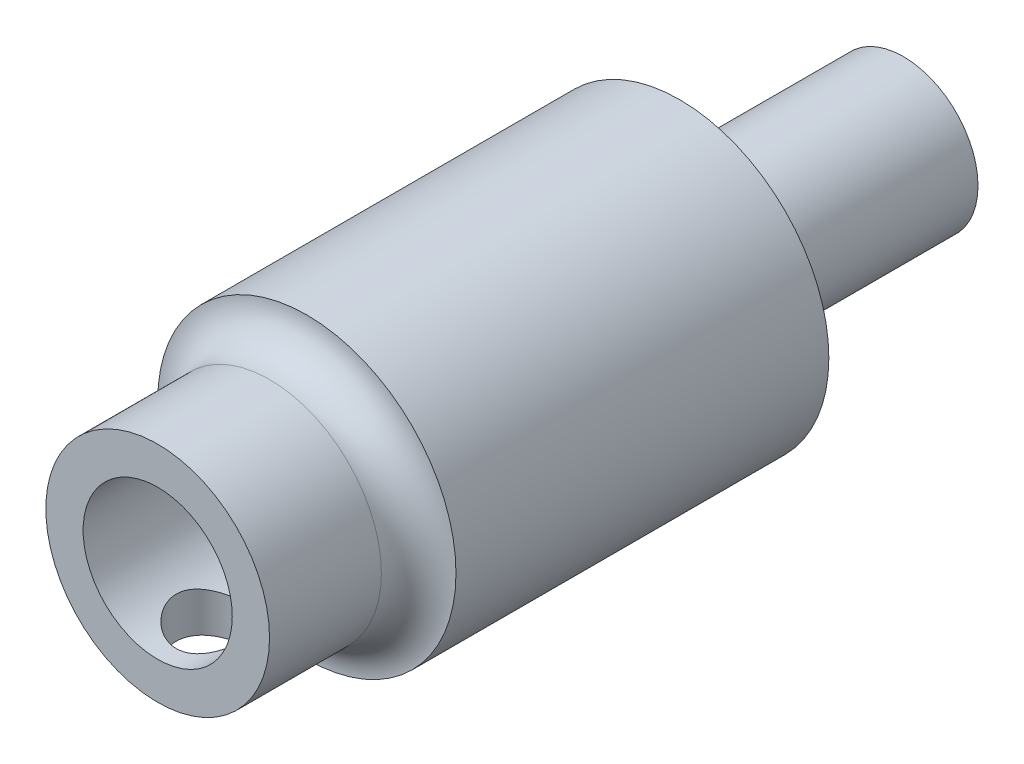
ISO-10303-21;
HEADER;
FILE_DESCRIPTION(('STEP AP214'),'2;1');
FILE_NAME('part.step','',(''),(''),'','','');
FILE_SCHEMA(('AUTOMOTIVE_DESIGN { 1 0 10303 214 1 1 1 1 }'));
ENDSEC;
DATA;
#1=APPLICATION_CONTEXT('core data for automotive mechanical design processes');
#2=APPLICATION_PROTOCOL_DEFINITION('international standard','automotive_design',2000,#1);
#3=PRODUCT_CONTEXT('',#1,'mechanical');
#4=PRODUCT('Part','Part','',(#3));
#5=PRODUCT_RELATED_PRODUCT_CATEGORY('part','',(#4));
#6=PRODUCT_DEFINITION_FORMATION('','',#4);
#7=PRODUCT_DEFINITION_CONTEXT('part definition',#1,'design');
#8=PRODUCT_DEFINITION('design','',#6,#7);
#9=PRODUCT_DEFINITION_SHAPE('','',#8);
#10=(LENGTH_UNIT() NAMED_UNIT(*) SI_UNIT(.MILLI.,.METRE.));
#11=(NAMED_UNIT(*) PLANE_ANGLE_UNIT() SI_UNIT($,.RADIAN.));
#12=(NAMED_UNIT(*) SI_UNIT($,.STERADIAN.) SOLID_ANGLE_UNIT());
#13=UNCERTAINTY_MEASURE_WITH_UNIT(LENGTH_MEASURE(1.E-05),#10,'distance_accuracy_value','');
#14=(GEOMETRIC_REPRESENTATION_CONTEXT(3) GLOBAL_UNCERTAINTY_ASSIGNED_CONTEXT((#13)) GLOBAL_UNIT_ASSIGNED_CONTEXT((#10,
#11,#12)) REPRESENTATION_CONTEXT('',''));
#15=CARTESIAN_POINT('',(0.,0.,0.));
#16=DIRECTION('',(0.,0.,1.));
#17=DIRECTION('',(1.,0.,0.));
#18=AXIS2_PLACEMENT_3D('',#15,#16,#17);
#19=CARTESIAN_POINT('',(0.,0.,5.5));
#20=DIRECTION('',(0.,0.,1.));
#21=DIRECTION('',(1.,0.,0.));
#22=AXIS2_PLACEMENT_3D('',#19,#20,#21);
#23=TOROIDAL_SURFACE('',#22,2.,0.5);
#24=CARTESIAN_POINT('',(0.,0.,5.));
#25=DIRECTION('',(0.,0.,1.));
#26=DIRECTION('',(1.,0.,0.));
#27=AXIS2_PLACEMENT_3D('',#24,#25,#26);
#28=CIRCLE('',#27,2.);
#29=CARTESIAN_POINT('',(2.,0.,5.));
#30=VERTEX_POINT('',#29);
#31=EDGE_CURVE('E103',#30,#30,#28,.T.);
#32=ORIENTED_EDGE('',*,*,#31,.T.);
#33=EDGE_LOOP('',(#32));
#34=FACE_BOUND('',#33,.T.);
#35=CARTESIAN_POINT('',(0.,0.,5.5));
#36=DIRECTION('',(0.,0.,1.));
#37=DIRECTION('',(1.,0.,0.));
#38=AXIS2_PLACEMENT_3D('',#35,#36,#37);
#39=CIRCLE('',#38,1.5);
#40=CARTESIAN_POINT('',(1.5,0.,5.5));
#41=VERTEX_POINT('',#40);
#42=EDGE_CURVE('E65',#41,#41,#39,.T.);
#43=ORIENTED_EDGE('',*,*,#42,.F.);
#44=EDGE_LOOP('',(#43));
#45=FACE_BOUND('',#44,.T.);
#46=ADVANCED_FACE('F41',(#34,#45),#23,.F.);
#47=CARTESIAN_POINT('',(0.,0.,-0.5));
#48=DIRECTION('',(0.,0.,1.));
#49=DIRECTION('',(1.,0.,0.));
#50=AXIS2_PLACEMENT_3D('',#47,#48,#49);
#51=TOROIDAL_SURFACE('',#50,1.5,0.5);
#52=CARTESIAN_POINT('',(0.,0.,0.));
#53=DIRECTION('',(0.,0.,1.));
#54=DIRECTION('',(1.,0.,0.));
#55=AXIS2_PLACEMENT_3D('',#52,#53,#54);
#56=CIRCLE('',#55,1.5);
#57=CARTESIAN_POINT('',(1.5,0.,0.));
#58=VERTEX_POINT('',#57);
#59=EDGE_CURVE('E114',#58,#58,#56,.T.);
#60=ORIENTED_EDGE('',*,*,#59,.F.);
#61=EDGE_LOOP('',(#60));
#62=FACE_BOUND('',#61,.T.);
#63=CARTESIAN_POINT('',(0.,0.,-0.5));
#64=DIRECTION('',(0.,0.,1.));
#65=DIRECTION('',(1.,0.,0.));
#66=AXIS2_PLACEMENT_3D('',#63,#64,#65);
#67=CIRCLE('',#66,1.);
#68=CARTESIAN_POINT('',(1.,0.,-0.5));
#69=VERTEX_POINT('',#68);
#70=EDGE_CURVE('E118',#69,#69,#67,.F.);
#71=ORIENTED_EDGE('',*,*,#70,.F.);
#72=EDGE_LOOP('',(#71));
#73=FACE_BOUND('',#72,.T.);
#74=ADVANCED_FACE('F130',(#62,#73),#51,.F.);
#75=CARTESIAN_POINT('',(0.,0.,5.));
#76=DIRECTION('',(0.,0.,-1.));
#77=DIRECTION('',(-1.,0.,0.));
#78=AXIS2_PLACEMENT_3D('',#75,#76,#77);
#79=CYLINDRICAL_SURFACE('',#78,2.);
#80=ORIENTED_EDGE('',*,*,#31,.F.);
#81=EDGE_LOOP('',(#80));
#82=FACE_BOUND('',#81,.T.);
#83=CARTESIAN_POINT('',(0.,0.,0.));
#84=DIRECTION('',(0.,0.,1.));
#85=DIRECTION('',(1.,0.,0.));
#86=AXIS2_PLACEMENT_3D('',#83,#84,#85);
#87=CIRCLE('',#86,2.);
#88=CARTESIAN_POINT('',(2.,0.,0.));
#89=VERTEX_POINT('',#88);
#90=EDGE_CURVE('E102',#89,#89,#87,.T.);
#91=ORIENTED_EDGE('',*,*,#90,.T.);
#92=EDGE_LOOP('',(#91));
#93=FACE_BOUND('',#92,.T.);
#94=ADVANCED_FACE('F135',(#82,#93),#79,.T.);
#95=CARTESIAN_POINT('',(0.,0.,0.));
#96=DIRECTION('',(0.,0.,1.));
#97=DIRECTION('',(1.,0.,0.));
#98=AXIS2_PLACEMENT_3D('',#95,#96,#97);
#99=PLANE('',#98);
#100=ORIENTED_EDGE('',*,*,#59,.T.);
#101=EDGE_LOOP('',(#100));
#102=FACE_BOUND('',#101,.T.);
#103=ORIENTED_EDGE('',*,*,#90,.F.);
#104=EDGE_LOOP('',(#103));
#105=FACE_BOUND('',#104,.T.);
#106=ADVANCED_FACE('F141',(#102,#105),#99,.F.);
#107=CARTESIAN_POINT('',(0.,0.,7.));
#108=DIRECTION('',(0.,0.,1.));
#109=DIRECTION('',(1.,0.,0.));
#110=AXIS2_PLACEMENT_3D('',#107,#108,#109);
#111=PLANE('',#110);
#112=CARTESIAN_POINT('',(0.,0.,7.));
#113=DIRECTION('',(0.,0.,1.));
#114=DIRECTION('',(1.,0.,0.));
#115=AXIS2_PLACEMENT_3D('',#112,#113,#114);
#116=CIRCLE('',#115,1.5);
#117=CARTESIAN_POINT('',(1.5,0.,7.));
#118=VERTEX_POINT('',#117);
#119=EDGE_CURVE('E98',#118,#118,#116,.T.);
#120=ORIENTED_EDGE('',*,*,#119,.T.);
#121=EDGE_LOOP('',(#120));
#122=FACE_BOUND('',#121,.T.);
#123=CARTESIAN_POINT('',(0.,0.,7.));
#124=DIRECTION('',(0.,0.,1.));
#125=DIRECTION('',(1.,0.,0.));
#126=AXIS2_PLACEMENT_3D('',#123,#124,#125);
#127=CIRCLE('',#126,1.);
#128=CARTESIAN_POINT('',(1.,0.,7.));
#129=VERTEX_POINT('',#128);
#130=EDGE_CURVE('E94',#129,#129,#127,.T.);
#131=ORIENTED_EDGE('',*,*,#130,.F.);
#132=EDGE_LOOP('',(#131));
#133=FACE_BOUND('',#132,.T.);
#134=ADVANCED_FACE('F146',(#122,#133),#111,.T.);
#135=CARTESIAN_POINT('',(0.,0.,7.));
#136=DIRECTION('',(0.,0.,-1.));
#137=DIRECTION('',(-1.,0.,0.));
#138=AXIS2_PLACEMENT_3D('',#135,#136,#137);
#139=CYLINDRICAL_SURFACE('',#138,1.5);
#140=CARTESIAN_POINT('',(0.,-1.5,6.75));
#141=CARTESIAN_POINT('',(0.0272816814433612,-1.50000007650472,6.75000012686582));
#142=CARTESIAN_POINT('',(0.0545625972692746,-1.49924884753774,6.74775986693639));
#143=CARTESIAN_POINT('',(0.108320880436486,-1.49632605101639,6.73888544559139));
#144=CARTESIAN_POINT('',(0.134798164059408,-1.49415433601069,6.73225082802554));
#145=CARTESIAN_POINT('',(0.186166394750888,-1.48862653953228,6.71484037830797));
#146=CARTESIAN_POINT('',(0.211059912943018,-1.48527243865453,6.70407146877035));
#147=CARTESIAN_POINT('',(0.25868746840266,-1.47772222858644,6.67872941358084));
#148=CARTESIAN_POINT('',(0.281421078479346,-1.47352595333789,6.66415551749874));
#149=CARTESIAN_POINT('',(0.324870837511139,-1.46457047221606,6.63108709757058));
#150=CARTESIAN_POINT('',(0.345501850149179,-1.45979778232283,6.61248438286959));
#151=CARTESIAN_POINT('',(0.383416346351017,-1.45030157391171,6.57211642264688));
#152=CARTESIAN_POINT('',(0.400699092744639,-1.44557806643817,6.55035048253637));
#153=CARTESIAN_POINT('',(0.431912471114024,-1.43656666240137,6.50350744240113));
#154=CARTESIAN_POINT('',(0.445732429110873,-1.43229519643517,6.47835313013151));
#155=CARTESIAN_POINT('',(0.468909436938503,-1.42487652703629,6.42591195277315));
#156=CARTESIAN_POINT('',(0.478267848692048,-1.4217289805919,6.3986257414277));
#157=CARTESIAN_POINT('',(0.491936730754162,-1.41705651655216,6.34366338924975));
#158=CARTESIAN_POINT('',(0.496406724138346,-1.41548047960085,6.31603139573733));
#159=CARTESIAN_POINT('',(0.500670561669923,-1.41397828389571,6.2603681229003));
#160=CARTESIAN_POINT('',(0.500465850802425,-1.41405161531,6.23233696963626));
#161=CARTESIAN_POINT('',(0.495509951851011,-1.41579507485375,6.17803168477975));
#162=CARTESIAN_POINT('',(0.49096695658331,-1.41739207928749,6.15173579854096));
#163=CARTESIAN_POINT('',(0.477803081424895,-1.42188328867294,6.10030329019611));
#164=CARTESIAN_POINT('',(0.469181713295985,-1.42477764893409,6.07516680728234));
#165=CARTESIAN_POINT('',(0.447969529030053,-1.43158955564248,6.02629362520439));
#166=CARTESIAN_POINT('',(0.435317024353617,-1.43552282896189,6.00258598726527));
#167=CARTESIAN_POINT('',(0.406444553151583,-1.44396279288233,5.9575645458601));
#168=CARTESIAN_POINT('',(0.390223556182006,-1.44846964895333,5.9362514365333));
#169=CARTESIAN_POINT('',(0.353674666341114,-1.45783664583764,5.89545420091962));
#170=CARTESIAN_POINT('',(0.333176575038154,-1.46270294677393,5.87612365274547));
#171=CARTESIAN_POINT('',(0.289169784985032,-1.47203469193547,5.8411343666683));
#172=CARTESIAN_POINT('',(0.265660797830407,-1.47650009769041,5.82547598091775));
#173=CARTESIAN_POINT('',(0.215973806523133,-1.48458553968889,5.79815184988247));
#174=CARTESIAN_POINT('',(0.189771638208167,-1.48819675004018,5.78652725432964));
#175=CARTESIAN_POINT('',(0.135634541682253,-1.49410283572219,5.76789841302215));
#176=CARTESIAN_POINT('',(0.107700219077476,-1.4963981682744,5.76089256228828));
#177=CARTESIAN_POINT('',(0.0521919147646512,-1.4993381353572,5.75197216698882));
#178=CARTESIAN_POINT('',(0.024654799932422,-1.50005000916865,5.74985009541363));
#179=CARTESIAN_POINT('',(-0.0303875349801189,-1.49994451347413,5.75016633679923));
#180=CARTESIAN_POINT('',(-0.0578927596598242,-1.49912740209676,5.75260387998993));
#181=CARTESIAN_POINT('',(-0.11125993315213,-1.49610012358557,5.76180595386798));
#182=CARTESIAN_POINT('',(-0.137146403417429,-1.49393099355614,5.76844310302476));
#183=CARTESIAN_POINT('',(-0.187427979289781,-1.48845923415017,5.78569672223335));
#184=CARTESIAN_POINT('',(-0.21182289425428,-1.48515646023271,5.79631369973384));
#185=CARTESIAN_POINT('',(-0.259144148196661,-1.47764465643714,5.82153521592045));
#186=CARTESIAN_POINT('',(-0.282014979608665,-1.47341407378153,5.8362372966418));
#187=CARTESIAN_POINT('',(-0.325032415067702,-1.46452626957872,5.86909707500653));
#188=CARTESIAN_POINT('',(-0.345178183897447,-1.45986891795944,5.88725582801508));
#189=CARTESIAN_POINT('',(-0.383126253903507,-1.45038423991236,5.92748937550413));
#190=CARTESIAN_POINT('',(-0.400780484624246,-1.44555880547578,5.94970461346662));
#191=CARTESIAN_POINT('',(-0.432128761160427,-1.43649986643491,5.99688578390225));
#192=CARTESIAN_POINT('',(-0.445822773960422,-1.4322663667656,6.0218517393051));
#193=CARTESIAN_POINT('',(-0.468798465211681,-1.42491195910154,6.0738365076533));
#194=CARTESIAN_POINT('',(-0.478089066098884,-1.42178880450316,6.10085103962139));
#195=CARTESIAN_POINT('',(-0.491947333396082,-1.41705416199567,6.15618932506208));
#196=CARTESIAN_POINT('',(-0.496517127480622,-1.41544199311349,6.18451248271653));
#197=CARTESIAN_POINT('',(-0.50063814123519,-1.41398929437536,6.24009854800661));
#198=CARTESIAN_POINT('',(-0.500435128655464,-1.4140620017215,6.26734117012587));
#199=CARTESIAN_POINT('',(-0.495621146727439,-1.4157563496178,6.32138253744987));
#200=CARTESIAN_POINT('',(-0.491010439729444,-1.41737789797942,6.34818130897646));
#201=CARTESIAN_POINT('',(-0.477685906563491,-1.42192262139472,6.40006783150633));
#202=CARTESIAN_POINT('',(-0.46905167300744,-1.42482049007757,6.42517841250362));
#203=CARTESIAN_POINT('',(-0.447989682880191,-1.43158199412717,6.47361370346777));
#204=CARTESIAN_POINT('',(-0.43556108427699,-1.43544584382648,6.49693801559363));
#205=CARTESIAN_POINT('',(-0.406630346291625,-1.4439141461203,6.54224183496185));
#206=CARTESIAN_POINT('',(-0.389974121382267,-1.44854355820802,6.5641182509493));
#207=CARTESIAN_POINT('',(-0.353321441567849,-1.45791678141893,6.604844906692));
#208=CARTESIAN_POINT('',(-0.333324042225748,-1.46266062456259,6.62369428784401));
#209=CARTESIAN_POINT('',(-0.289620778460337,-1.47195015262697,6.65857220614462));
#210=CARTESIAN_POINT('',(-0.265800756749863,-1.47648090900608,6.67446217387551));
#211=CARTESIAN_POINT('',(-0.215678678703314,-1.48462995586326,6.70199521442532));
#212=CARTESIAN_POINT('',(-0.189377259066175,-1.4882484795397,6.71363937296102));
#213=CARTESIAN_POINT('',(-0.136246823600488,-1.49402757534266,6.73186081624434));
#214=CARTESIAN_POINT('',(-0.109493878838205,-1.4962460621126,6.73864123313169));
#215=CARTESIAN_POINT('',(-0.055160208005124,-1.49923203532112,6.74771014033856));
#216=CARTESIAN_POINT('',(-0.0275797127843737,-1.49999992265952,6.74999987174827));
#217=CARTESIAN_POINT('',(0.,-1.5,6.75));
#218=B_SPLINE_CURVE_WITH_KNOTS('',3,(#140,#141,#142,#143,#144,#145,#146,#147,#148,#149,#150,
#151,#152,#153,#154,#155,#156,#157,#158,#159,#160,#161,#162,#163,#164,#165,#166,#167,#168,#169,
#170,#171,#172,#173,#174,#175,#176,#177,#178,#179,#180,#181,#182,#183,#184,#185,#186,#187,#188,
#189,#190,#191,#192,#193,#194,#195,#196,#197,#198,#199,#200,#201,#202,#203,#204,#205,#206,#207,
#208,#209,#210,#211,#212,#213,#214,#215,#216,#217),.UNSPECIFIED.,.T.,.F.,(4,2,2,2,2,2,2,2,2,2,2,
2,2,2,2,2,2,2,2,2,2,2,2,2,2,2,2,2,2,2,2,2,2,2,2,2,2,2,4),(0.,0.0817435530130054,
0.163495592633761,0.245111336435137,0.32674318889955,0.41092342141378,0.495122166437651,
0.581741924117353,0.668335223464167,0.75200962868792,0.835658169894179,0.915484132713153,
0.995319654234163,1.07644085573241,1.15758551274779,1.24296652901359,1.32835572978984,
1.41459202820854,1.50079834434279,1.5832679158326,1.66572356577764,1.74579078984782,
1.82586822637727,1.90805199917543,1.99026090406621,2.07620511436051,2.16215004113173,
2.24792006907884,2.33365142346098,2.41497833023985,2.49630039666268,2.57607793530789,
2.65587319078569,2.73915033336482,2.8224510555247,2.9089983040813,2.99552340566808,
3.07818279177487,3.1608193300965),.UNSPECIFIED.);
#219=CARTESIAN_POINT('',(0.,-1.5,6.75));
#220=VERTEX_POINT('',#219);
#221=EDGE_CURVE('E82',#220,#220,#218,.T.);
#222=ORIENTED_EDGE('',*,*,#221,.T.);
#223=EDGE_LOOP('',(#222));
#224=FACE_BOUND('',#223,.T.);
#225=ORIENTED_EDGE('',*,*,#42,.T.);
#226=EDGE_LOOP('',(#225));
#227=FACE_BOUND('',#226,.T.);
#228=ORIENTED_EDGE('',*,*,#119,.F.);
#229=EDGE_LOOP('',(#228));
#230=FACE_BOUND('',#229,.T.);
#231=ADVANCED_FACE('F126',(#224,#227,#230),#139,.T.);
#232=CARTESIAN_POINT('',(0.,0.,7.));
#233=DIRECTION('',(0.,0.,-1.));
#234=DIRECTION('',(-1.,0.,0.));
#235=AXIS2_PLACEMENT_3D('',#232,#233,#234);
#236=CYLINDRICAL_SURFACE('',#235,1.);
#237=CARTESIAN_POINT('',(0.,-1.,6.75));
#238=CARTESIAN_POINT('',(0.0262859814764928,-0.999998567020754,6.74999834884025));
#239=CARTESIAN_POINT('',(0.0526032998490158,-0.998952455097588,6.74791496343916));
#240=CARTESIAN_POINT('',(0.104460117634212,-0.994870780186981,6.73967355982954));
#241=CARTESIAN_POINT('',(0.129998043356751,-0.991831439144918,6.73350780350118));
#242=CARTESIAN_POINT('',(0.179466772440287,-0.984081397016558,6.7174030956916));
#243=CARTESIAN_POINT('',(0.20340340146959,-0.979377195887601,6.70747880787599));
#244=CARTESIAN_POINT('',(0.249236308403282,-0.968728882578893,6.68421468931753));
#245=CARTESIAN_POINT('',(0.271132746995025,-0.96278486816765,6.67087512787557));
#246=CARTESIAN_POINT('',(0.313753908880959,-0.949781291290285,6.64024137525735));
#247=CARTESIAN_POINT('',(0.334327605561056,-0.942675995637679,6.62275676038018));
#248=CARTESIAN_POINT('',(0.372389722433489,-0.928299851233722,6.58473926037648));
#249=CARTESIAN_POINT('',(0.389875791553383,-0.921028881045175,6.56420407411378));
#250=CARTESIAN_POINT('',(0.422626000225139,-0.906494755986735,6.51875832523831));
#251=CARTESIAN_POINT('',(0.437612667775819,-0.899275934850659,6.49363195082704));
#252=CARTESIAN_POINT('',(0.463084113445348,-0.886429893861603,6.44081633200689));
#253=CARTESIAN_POINT('',(0.473572107483167,-0.880801538034948,6.41312893563862));
#254=CARTESIAN_POINT('',(0.489066221094294,-0.872289335189043,6.35766744728904));
#255=CARTESIAN_POINT('',(0.49436292854022,-0.869261357918568,6.3299977739663));
#256=CARTESIAN_POINT('',(0.500213496654423,-0.865909449742639,6.27401058111026));
#257=CARTESIAN_POINT('',(0.500772044186537,-0.865582846716441,6.24569372956442));
#258=CARTESIAN_POINT('',(0.497343643586147,-0.867554651286243,6.19285698784232));
#259=CARTESIAN_POINT('',(0.49389227976841,-0.869543818310068,6.16828798438848));
#260=CARTESIAN_POINT('',(0.483469924528466,-0.875381143669252,6.12013904531348));
#261=CARTESIAN_POINT('',(0.476497811948825,-0.879229894158882,6.09655942734734));
#262=CARTESIAN_POINT('',(0.459104890193001,-0.888437382063705,6.05038543371717));
#263=CARTESIAN_POINT('',(0.448607533557997,-0.893829203319993,6.02782680060711));
#264=CARTESIAN_POINT('',(0.424520843834001,-0.905517021407018,5.984682853705));
#265=CARTESIAN_POINT('',(0.410930121906234,-0.911813423900953,5.96409843219996));
#266=CARTESIAN_POINT('',(0.379033027456394,-0.925565789516429,5.92273937362839));
#267=CARTESIAN_POINT('',(0.36034722918464,-0.933067551183731,5.90227156321192));
#268=CARTESIAN_POINT('',(0.319777789370686,-0.947738116502036,5.86463229070455));
#269=CARTESIAN_POINT('',(0.297892628287142,-0.954906759794005,5.84746240398306));
#270=CARTESIAN_POINT('',(0.250258252915924,-0.96850993641482,5.81615716948514));
#271=CARTESIAN_POINT('',(0.224376795799704,-0.974894920810037,5.80219976377713));
#272=CARTESIAN_POINT('',(0.170233107744398,-0.985789405606211,5.77895148547849));
#273=CARTESIAN_POINT('',(0.141972788132638,-0.990300394717763,5.76965690749242));
#274=CARTESIAN_POINT('',(0.08638324583035,-0.99662166870718,5.75676229814166));
#275=CARTESIAN_POINT('',(0.0591707652741612,-0.998624691506558,5.75275438212661));
#276=CARTESIAN_POINT('',(0.00438979997467602,-1.00036506729551,5.74926763443275));
#277=CARTESIAN_POINT('',(-0.0231785099349514,-1.00010349360656,5.74978665718026));
#278=CARTESIAN_POINT('',(-0.0756164859929975,-0.997455961267204,5.75510334420938));
#279=CARTESIAN_POINT('',(-0.100529704024978,-0.995236228440948,5.75956626636501));
#280=CARTESIAN_POINT('',(-0.149203446150959,-0.989110856574094,5.77211903594754));
#281=CARTESIAN_POINT('',(-0.172963842845499,-0.985205031671662,5.78020928322668));
#282=CARTESIAN_POINT('',(-0.219444304224833,-0.975921257068347,5.79999923321659));
#283=CARTESIAN_POINT('',(-0.242115198503078,-0.970504408849696,5.81179552505841));
#284=CARTESIAN_POINT('',(-0.285230680849461,-0.958719871585545,5.83855376782302));
#285=CARTESIAN_POINT('',(-0.305674314887642,-0.952351777828925,5.85351706729672));
#286=CARTESIAN_POINT('',(-0.345883844645327,-0.938541106687321,5.88788021266644));
#287=CARTESIAN_POINT('',(-0.36538603891232,-0.931054424242206,5.90757143422678));
#288=CARTESIAN_POINT('',(-0.400928160556621,-0.916311958019372,5.94996257563465));
#289=CARTESIAN_POINT('',(-0.416965692845421,-0.909056336907631,5.97266455940819));
#290=CARTESIAN_POINT('',(-0.445853957248848,-0.89525596113034,6.02182182710015));
#291=CARTESIAN_POINT('',(-0.458512747939319,-0.88876264831736,6.0484056331043));
#292=CARTESIAN_POINT('',(-0.479041413006902,-0.877870361840631,6.10375503384626));
#293=CARTESIAN_POINT('',(-0.486917457943785,-0.87346869120309,6.13251776325059));
#294=CARTESIAN_POINT('',(-0.49693084372484,-0.867807505043333,6.18845511143072));
#295=CARTESIAN_POINT('',(-0.499546498200433,-0.866286917302456,6.21551712671452));
#296=CARTESIAN_POINT('',(-0.500344577190394,-0.865826773230875,6.26972353358537));
#297=CARTESIAN_POINT('',(-0.4985289233122,-0.866886098137763,6.29686788436972));
#298=CARTESIAN_POINT('',(-0.490963062796132,-0.871189310250123,6.34774175076601));
#299=CARTESIAN_POINT('',(-0.4856041571714,-0.874215472411968,6.3715502350722));
#300=CARTESIAN_POINT('',(-0.471587679112323,-0.881855080939587,6.41790405971235));
#301=CARTESIAN_POINT('',(-0.462929045579905,-0.886469037848378,6.44044899104598));
#302=CARTESIAN_POINT('',(-0.441907872650342,-0.89714265182264,6.4853124254933));
#303=CARTESIAN_POINT('',(-0.42933556890823,-0.903278611980952,6.50751395091485));
#304=CARTESIAN_POINT('',(-0.401075485818318,-0.91617665817295,6.54963726809029));
#305=CARTESIAN_POINT('',(-0.385386085619325,-0.92293906897261,6.56955786525925));
#306=CARTESIAN_POINT('',(-0.349101663332321,-0.937311615796565,6.60907099117881));
#307=CARTESIAN_POINT('',(-0.328142211505086,-0.944924916557343,6.62832955118096));
#308=CARTESIAN_POINT('',(-0.28307740311014,-0.959388761275438,6.66313149171182));
#309=CARTESIAN_POINT('',(-0.258970361628392,-0.966238893040199,6.67867286971315));
#310=CARTESIAN_POINT('',(-0.207965798409973,-0.978490047925516,6.7056181813811));
#311=CARTESIAN_POINT('',(-0.181049751967307,-0.983880482814545,6.71699208470572));
#312=CARTESIAN_POINT('',(-0.125371050647096,-0.992506706817327,6.73490408395948));
#313=CARTESIAN_POINT('',(-0.0966138998115833,-0.99574861686466,6.74145592341479));
#314=CARTESIAN_POINT('',(-0.0563009732416923,-0.998477309548316,6.74694870553792));
#315=CARTESIAN_POINT('',(-0.0450809397197498,-0.999046826696008,6.74809132043181));
#316=CARTESIAN_POINT('',(-0.0225758659035793,-0.999808484889324,6.7496173327584));
#317=CARTESIAN_POINT('',(-0.0112908238236911,-1.00000061551882,6.7500007092356));
#318=CARTESIAN_POINT('',(0.,-1.,6.75));
#319=B_SPLINE_CURVE_WITH_KNOTS('',3,(#237,#238,#239,#240,#241,#242,#243,#244,#245,#246,#247,
#248,#249,#250,#251,#252,#253,#254,#255,#256,#257,#258,#259,#260,#261,#262,#263,#264,#265,#266,
#267,#268,#269,#270,#271,#272,#273,#274,#275,#276,#277,#278,#279,#280,#281,#282,#283,#284,#285,
#286,#287,#288,#289,#290,#291,#292,#293,#294,#295,#296,#297,#298,#299,#300,#301,#302,#303,#304,
#305,#306,#307,#308,#309,#310,#311,#312,#313,#314,#315,#316,#317,#318),.UNSPECIFIED.,.T.,.F.,(4,
2,2,2,2,2,2,2,2,2,2,2,2,2,2,2,2,2,2,2,2,2,2,2,2,2,2,2,2,2,2,2,2,2,2,2,2,2,2,2,4),(0.,
0.0788121287101463,0.157774074854599,0.236431077746149,0.315081880290784,0.398490879359045,
0.481963118827018,0.571908632153765,0.661789739491406,0.746290060701148,0.830706786645103,
0.905028562046603,0.979374019628393,1.05545120084244,1.13156260630111,1.21732470666939,
1.30312767299343,1.3929151110722,1.4826310845614,1.56491645235673,1.64716282255738,
1.72303453253061,1.79891460815466,1.87696428013949,1.9550472537417,2.04079805322209,
2.12660794307716,2.21657341079837,2.30642255970389,2.38764653749187,2.46883529930003,
2.54228965122091,2.61576764391839,2.69418228387807,2.77263780569479,2.86062621376249,
2.94866191688286,3.03732006831463,3.12572454312465,3.15957640068849,3.19342919257423),.UNSPECIFIED.);
#320=CARTESIAN_POINT('',(0.,-1.,6.75));
#321=VERTEX_POINT('',#320);
#322=EDGE_CURVE('E44',#321,#321,#319,.T.);
#323=ORIENTED_EDGE('',*,*,#322,.F.);
#324=EDGE_LOOP('',(#323));
#325=FACE_BOUND('',#324,.T.);
#326=ORIENTED_EDGE('',*,*,#130,.T.);
#327=EDGE_LOOP('',(#326));
#328=FACE_BOUND('',#327,.T.);
#329=CARTESIAN_POINT('',(0.,0.,5.));
#330=DIRECTION('',(0.,0.,1.));
#331=DIRECTION('',(1.,0.,0.));
#332=AXIS2_PLACEMENT_3D('',#329,#330,#331);
#333=CIRCLE('',#332,1.);
#334=CARTESIAN_POINT('',(1.,0.,5.));
#335=VERTEX_POINT('',#334);
#336=EDGE_CURVE('E107',#335,#335,#333,.F.);
#337=ORIENTED_EDGE('',*,*,#336,.T.);
#338=EDGE_LOOP('',(#337));
#339=FACE_BOUND('',#338,.T.);
#340=ADVANCED_FACE('F184',(#325,#328,#339),#236,.F.);
#341=CARTESIAN_POINT('',(0.,0.,5.));
#342=DIRECTION('',(0.,0.,1.));
#343=DIRECTION('',(1.,0.,0.));
#344=AXIS2_PLACEMENT_3D('',#341,#342,#343);
#345=PLANE('',#344);
#346=ORIENTED_EDGE('',*,*,#336,.F.);
#347=EDGE_LOOP('',(#346));
#348=FACE_BOUND('',#347,.T.);
#349=ADVANCED_FACE('F187',(#348),#345,.T.);
#350=CARTESIAN_POINT('',(0.,0.,-3.));
#351=DIRECTION('',(0.,0.,-1.));
#352=DIRECTION('',(-1.,0.,0.));
#353=AXIS2_PLACEMENT_3D('',#350,#351,#352);
#354=PLANE('',#353);
#355=CARTESIAN_POINT('',(0.,0.,-3.));
#356=DIRECTION('',(0.,0.,-1.));
#357=DIRECTION('',(-1.,0.,0.));
#358=AXIS2_PLACEMENT_3D('',#355,#356,#357);
#359=CIRCLE('',#358,1.);
#360=CARTESIAN_POINT('',(-1.,0.,-3.));
#361=VERTEX_POINT('',#360);
#362=EDGE_CURVE('E86',#361,#361,#359,.T.);
#363=ORIENTED_EDGE('',*,*,#362,.T.);
#364=EDGE_LOOP('',(#363));
#365=FACE_BOUND('',#364,.T.);
#366=CARTESIAN_POINT('',(0.,0.,-3.));
#367=DIRECTION('',(0.,0.,-1.));
#368=DIRECTION('',(-1.,0.,0.));
#369=AXIS2_PLACEMENT_3D('',#366,#367,#368);
#370=CIRCLE('',#369,0.5);
#371=CARTESIAN_POINT('',(-0.5,0.,-3.));
#372=VERTEX_POINT('',#371);
#373=EDGE_CURVE('E76',#372,#372,#370,.T.);
#374=ORIENTED_EDGE('',*,*,#373,.F.);
#375=EDGE_LOOP('',(#374));
#376=FACE_BOUND('',#375,.T.);
#377=ADVANCED_FACE('F182',(#365,#376),#354,.T.);
#378=CARTESIAN_POINT('',(0.,0.,-3.));
#379=DIRECTION('',(0.,0.,1.));
#380=DIRECTION('',(1.,0.,0.));
#381=AXIS2_PLACEMENT_3D('',#378,#379,#380);
#382=CYLINDRICAL_SURFACE('',#381,1.);
#383=CARTESIAN_POINT('',(0.,-1.,-1.25));
#384=CARTESIAN_POINT('',(0.0262859814764932,-0.999998567020754,-1.25000165115975));
#385=CARTESIAN_POINT('',(0.0526032998490163,-0.998952455097588,-1.25208503656084));
#386=CARTESIAN_POINT('',(0.104460117634213,-0.994870780186981,-1.26032644017046));
#387=CARTESIAN_POINT('',(0.129998043356752,-0.991831439144918,-1.26649219649882));
#388=CARTESIAN_POINT('',(0.179466772440287,-0.984081397016558,-1.2825969043084));
#389=CARTESIAN_POINT('',(0.20340340146959,-0.979377195887601,-1.29252119212401));
#390=CARTESIAN_POINT('',(0.249236308403282,-0.968728882578893,-1.31578531068247));
#391=CARTESIAN_POINT('',(0.271132746995025,-0.96278486816765,-1.32912487212443));
#392=CARTESIAN_POINT('',(0.31375390888096,-0.949781291290285,-1.35975862474265));
#393=CARTESIAN_POINT('',(0.334327605561056,-0.942675995637679,-1.37724323961982));
#394=CARTESIAN_POINT('',(0.372389722433489,-0.928299851233722,-1.41526073962352));
#395=CARTESIAN_POINT('',(0.389875791553383,-0.921028881045175,-1.43579592588622));
#396=CARTESIAN_POINT('',(0.422626000225139,-0.906494755986735,-1.48124167476169));
#397=CARTESIAN_POINT('',(0.437612667775818,-0.899275934850659,-1.50636804917296));
#398=CARTESIAN_POINT('',(0.463084113445348,-0.886429893861603,-1.55918366799311));
#399=CARTESIAN_POINT('',(0.473572107483167,-0.880801538034948,-1.58687106436137));
#400=CARTESIAN_POINT('',(0.489066221094294,-0.872289335189043,-1.64233255271096));
#401=CARTESIAN_POINT('',(0.494362928540221,-0.869261357918568,-1.6700022260337));
#402=CARTESIAN_POINT('',(0.500213496654423,-0.865909449742639,-1.72598941888974));
#403=CARTESIAN_POINT('',(0.500772044186537,-0.86558284671644,-1.75430627043558));
#404=CARTESIAN_POINT('',(0.497343643586147,-0.867554651286242,-1.80714301215768));
#405=CARTESIAN_POINT('',(0.493892279768411,-0.869543818310067,-1.83171201561153));
#406=CARTESIAN_POINT('',(0.483469924528466,-0.875381143669251,-1.87986095468652));
#407=CARTESIAN_POINT('',(0.476497811948826,-0.879229894158881,-1.90344057265266));
#408=CARTESIAN_POINT('',(0.459104890193002,-0.888437382063705,-1.94961456628283));
#409=CARTESIAN_POINT('',(0.448607533557997,-0.893829203319992,-1.97217319939289));
#410=CARTESIAN_POINT('',(0.424520843834001,-0.905517021407018,-2.015317146295));
#411=CARTESIAN_POINT('',(0.410930121906234,-0.911813423900953,-2.03590156780004));
#412=CARTESIAN_POINT('',(0.379033027456394,-0.925565789516429,-2.07726062637161));
#413=CARTESIAN_POINT('',(0.360347229184641,-0.933067551183731,-2.09772843678808));
#414=CARTESIAN_POINT('',(0.319777789370687,-0.947738116502036,-2.13536770929545));
#415=CARTESIAN_POINT('',(0.297892628287142,-0.954906759794004,-2.15253759601694));
#416=CARTESIAN_POINT('',(0.250258252915924,-0.96850993641482,-2.18384283051486));
#417=CARTESIAN_POINT('',(0.224376795799704,-0.974894920810037,-2.19780023622287));
#418=CARTESIAN_POINT('',(0.170233107744398,-0.985789405606211,-2.22104851452151));
#419=CARTESIAN_POINT('',(0.141972788132638,-0.990300394717763,-2.23034309250758));
#420=CARTESIAN_POINT('',(0.0863832458303507,-0.99662166870718,-2.24323770185834));
#421=CARTESIAN_POINT('',(0.0591707652741621,-0.998624691506558,-2.24724561787339));
#422=CARTESIAN_POINT('',(0.00438979997467673,-1.00036506729551,-2.25073236556725));
#423=CARTESIAN_POINT('',(-0.0231785099349508,-1.00010349360656,-2.25021334281974));
#424=CARTESIAN_POINT('',(-0.0756164859929969,-0.997455961267204,-2.24489665579062));
#425=CARTESIAN_POINT('',(-0.100529704024977,-0.995236228440948,-2.24043373363498));
#426=CARTESIAN_POINT('',(-0.149203446150958,-0.989110856574095,-2.22788096405246));
#427=CARTESIAN_POINT('',(-0.172963842845498,-0.985205031671662,-2.21979071677332));
#428=CARTESIAN_POINT('',(-0.219444304224833,-0.975921257068347,-2.20000076678341));
#429=CARTESIAN_POINT('',(-0.242115198503077,-0.970504408849696,-2.18820447494159));
#430=CARTESIAN_POINT('',(-0.285230680849461,-0.958719871585545,-2.16144623217698));
#431=CARTESIAN_POINT('',(-0.305674314887641,-0.952351777828926,-2.14648293270328));
#432=CARTESIAN_POINT('',(-0.345883844645327,-0.938541106687322,-2.11211978733356));
#433=CARTESIAN_POINT('',(-0.36538603891232,-0.931054424242207,-2.09242856577322));
#434=CARTESIAN_POINT('',(-0.40092816055662,-0.916311958019372,-2.05003742436535));
#435=CARTESIAN_POINT('',(-0.416965692845421,-0.909056336907632,-2.02733544059181));
#436=CARTESIAN_POINT('',(-0.445853957248848,-0.89525596113034,-1.97817817289984));
#437=CARTESIAN_POINT('',(-0.458512747939319,-0.88876264831736,-1.9515943668957));
#438=CARTESIAN_POINT('',(-0.479041413006901,-0.877870361840631,-1.89624496615374));
#439=CARTESIAN_POINT('',(-0.486917457943785,-0.87346869120309,-1.86748223674941));
#440=CARTESIAN_POINT('',(-0.496930843724839,-0.867807505043333,-1.81154488856928));
#441=CARTESIAN_POINT('',(-0.499546498200432,-0.866286917302456,-1.78448287328548));
#442=CARTESIAN_POINT('',(-0.500344577190394,-0.865826773230875,-1.73027646641464));
#443=CARTESIAN_POINT('',(-0.498528923312199,-0.866886098137763,-1.70313211563028));
#444=CARTESIAN_POINT('',(-0.490963062796131,-0.871189310250124,-1.65225824923399));
#445=CARTESIAN_POINT('',(-0.4856041571714,-0.874215472411968,-1.6284497649278));
#446=CARTESIAN_POINT('',(-0.471587679112323,-0.881855080939588,-1.58209594028765));
#447=CARTESIAN_POINT('',(-0.462929045579905,-0.886469037848378,-1.55955100895402));
#448=CARTESIAN_POINT('',(-0.441907872650341,-0.89714265182264,-1.5146875745067));
#449=CARTESIAN_POINT('',(-0.429335568908229,-0.903278611980953,-1.49248604908515));
#450=CARTESIAN_POINT('',(-0.401075485818317,-0.916176658172951,-1.45036273190971));
#451=CARTESIAN_POINT('',(-0.385386085619324,-0.92293906897261,-1.43044213474075));
#452=CARTESIAN_POINT('',(-0.349101663332321,-0.937311615796565,-1.39092900882119));
#453=CARTESIAN_POINT('',(-0.328142211505086,-0.944924916557343,-1.37167044881904));
#454=CARTESIAN_POINT('',(-0.28307740311014,-0.959388761275438,-1.33686850828818));
#455=CARTESIAN_POINT('',(-0.258970361628392,-0.966238893040199,-1.32132713028686));
#456=CARTESIAN_POINT('',(-0.207965798409973,-0.978490047925516,-1.2943818186189));
#457=CARTESIAN_POINT('',(-0.181049751967307,-0.983880482814545,-1.28300791529428));
#458=CARTESIAN_POINT('',(-0.125371050647095,-0.992506706817327,-1.26509591604052));
#459=CARTESIAN_POINT('',(-0.0966138998115828,-0.99574861686466,-1.25854407658521));
#460=CARTESIAN_POINT('',(-0.0563009732416918,-0.998477309548316,-1.25305129446208));
#461=CARTESIAN_POINT('',(-0.0450809397197493,-0.999046826696008,-1.25190867956819));
#462=CARTESIAN_POINT('',(-0.0225758659035788,-0.999808484889324,-1.2503826672416));
#463=CARTESIAN_POINT('',(-0.0112908238236907,-1.00000061551882,-1.2499992907644));
#464=CARTESIAN_POINT('',(0.,-1.,-1.25));
#465=B_SPLINE_CURVE_WITH_KNOTS('',3,(#383,#384,#385,#386,#387,#388,#389,#390,#391,#392,#393,
#394,#395,#396,#397,#398,#399,#400,#401,#402,#403,#404,#405,#406,#407,#408,#409,#410,#411,#412,
#413,#414,#415,#416,#417,#418,#419,#420,#421,#422,#423,#424,#425,#426,#427,#428,#429,#430,#431,
#432,#433,#434,#435,#436,#437,#438,#439,#440,#441,#442,#443,#444,#445,#446,#447,#448,#449,#450,
#451,#452,#453,#454,#455,#456,#457,#458,#459,#460,#461,#462,#463,#464),.UNSPECIFIED.,.T.,.F.,(4,
2,2,2,2,2,2,2,2,2,2,2,2,2,2,2,2,2,2,2,2,2,2,2,2,2,2,2,2,2,2,2,2,2,2,2,2,2,2,2,4),(0.,
0.0788121287101462,0.157774074854599,0.236431077746149,0.315081880290784,0.398490879359044,
0.481963118827018,0.571908632153763,0.661789739491405,0.746290060701148,0.830706786645102,
0.905028562046603,0.979374019628392,1.05545120084244,1.13156260630111,1.21732470666939,
1.30312767299343,1.3929151110722,1.4826310845614,1.56491645235673,1.64716282255738,
1.72303453253061,1.79891460815466,1.87696428013949,1.9550472537417,2.04079805322209,
2.12660794307716,2.21657341079837,2.30642255970389,2.38764653749187,2.46883529930003,
2.54228965122091,2.61576764391839,2.69418228387807,2.77263780569479,2.86062621376249,
2.94866191688286,3.03732006831463,3.12572454312465,3.15957640068849,3.19342919257423),.UNSPECIFIED.);
#466=CARTESIAN_POINT('',(0.,-1.,-1.25));
#467=VERTEX_POINT('',#466);
#468=EDGE_CURVE('E169',#467,#467,#465,.T.);
#469=ORIENTED_EDGE('',*,*,#468,.T.);
#470=EDGE_LOOP('',(#469));
#471=FACE_BOUND('',#470,.T.);
#472=ORIENTED_EDGE('',*,*,#70,.T.);
#473=EDGE_LOOP('',(#472));
#474=FACE_BOUND('',#473,.T.);
#475=ORIENTED_EDGE('',*,*,#362,.F.);
#476=EDGE_LOOP('',(#475));
#477=FACE_BOUND('',#476,.T.);
#478=ADVANCED_FACE('F71',(#471,#474,#477),#382,.T.);
#479=CARTESIAN_POINT('',(0.,0.,-3.));
#480=DIRECTION('',(0.,0.,1.));
#481=DIRECTION('',(1.,0.,0.));
#482=AXIS2_PLACEMENT_3D('',#479,#480,#481);
#483=CYLINDRICAL_SURFACE('',#482,0.5);
#484=CARTESIAN_POINT('',(0.,0.,-1.75));
#485=DIRECTION('',(0.,0.707106781186547,0.707106781186547));
#486=DIRECTION('',(0.,-0.707106781186547,0.707106781186547));
#487=AXIS2_PLACEMENT_3D('',#484,#485,#486);
#488=ELLIPSE('',#487,0.707106781186547,0.5);
#489=CARTESIAN_POINT('',(-0.5,0.,-1.75));
#490=VERTEX_POINT('',#489);
#491=CARTESIAN_POINT('',(0.5,0.,-1.75));
#492=VERTEX_POINT('',#491);
#493=EDGE_CURVE('E11',#490,#492,#488,.T.);
#494=ORIENTED_EDGE('',*,*,#493,.F.);
#495=CARTESIAN_POINT('',(0.,0.,-1.75));
#496=DIRECTION('',(0.,-0.707106781186547,0.707106781186547));
#497=DIRECTION('',(0.,0.707106781186547,0.707106781186547));
#498=AXIS2_PLACEMENT_3D('',#495,#496,#497);
#499=ELLIPSE('',#498,0.707106781186547,0.5);
#500=EDGE_CURVE('E55',#492,#490,#499,.F.);
#501=ORIENTED_EDGE('',*,*,#500,.F.);
#502=EDGE_LOOP('',(#494,#501));
#503=FACE_BOUND('',#502,.T.);
#504=ORIENTED_EDGE('',*,*,#373,.T.);
#505=EDGE_LOOP('',(#504));
#506=FACE_BOUND('',#505,.T.);
#507=CARTESIAN_POINT('',(0.,0.,0.));
#508=DIRECTION('',(0.,0.,-1.));
#509=DIRECTION('',(-1.,0.,0.));
#510=AXIS2_PLACEMENT_3D('',#507,#508,#509);
#511=CIRCLE('',#510,0.5);
#512=CARTESIAN_POINT('',(-0.5,0.,0.));
#513=VERTEX_POINT('',#512);
#514=EDGE_CURVE('E79',#513,#513,#511,.T.);
#515=ORIENTED_EDGE('',*,*,#514,.F.);
#516=EDGE_LOOP('',(#515));
#517=FACE_BOUND('',#516,.T.);
#518=ADVANCED_FACE('F67',(#503,#506,#517),#483,.F.);
#519=ORIENTED_EDGE('',*,*,#514,.T.);
#520=EDGE_LOOP('',(#519));
#521=FACE_BOUND('',#520,.T.);
#522=ADVANCED_FACE('F70',(#521),#99,.F.);
#523=CARTESIAN_POINT('',(0.,-2.,-1.75));
#524=DIRECTION('',(0.,1.,0.));
#525=DIRECTION('',(0.,0.,1.));
#526=AXIS2_PLACEMENT_3D('',#523,#524,#525);
#527=CYLINDRICAL_SURFACE('',#526,0.5);
#528=ORIENTED_EDGE('',*,*,#493,.T.);
#529=ORIENTED_EDGE('',*,*,#500,.T.);
#530=EDGE_LOOP('',(#528,#529));
#531=FACE_BOUND('',#530,.T.);
#532=ORIENTED_EDGE('',*,*,#468,.F.);
#533=EDGE_LOOP('',(#532));
#534=FACE_BOUND('',#533,.T.);
#535=ADVANCED_FACE('F61',(#531,#534),#527,.F.);
#536=CARTESIAN_POINT('',(0.,-2.,6.25));
#537=DIRECTION('',(0.,1.,0.));
#538=DIRECTION('',(0.,0.,1.));
#539=AXIS2_PLACEMENT_3D('',#536,#537,#538);
#540=CYLINDRICAL_SURFACE('',#539,0.5);
#541=ORIENTED_EDGE('',*,*,#322,.T.);
#542=EDGE_LOOP('',(#541));
#543=FACE_BOUND('',#542,.T.);
#544=ORIENTED_EDGE('',*,*,#221,.F.);
#545=EDGE_LOOP('',(#544));
#546=FACE_BOUND('',#545,.T.);
#547=ADVANCED_FACE('F159',(#543,#546),#540,.F.);
#548=CLOSED_SHELL('',(#46,#74,#94,#106,#134,#231,#340,#349,#377,#478,#518,#522,#535,#547));
#549=MANIFOLD_SOLID_BREP('B2',#548);
#550=ADVANCED_BREP_SHAPE_REPRESENTATION('',(#18,#549),#14);
#551=SHAPE_DEFINITION_REPRESENTATION(#9,#550);
ENDSEC;
END-ISO-10303-21;
